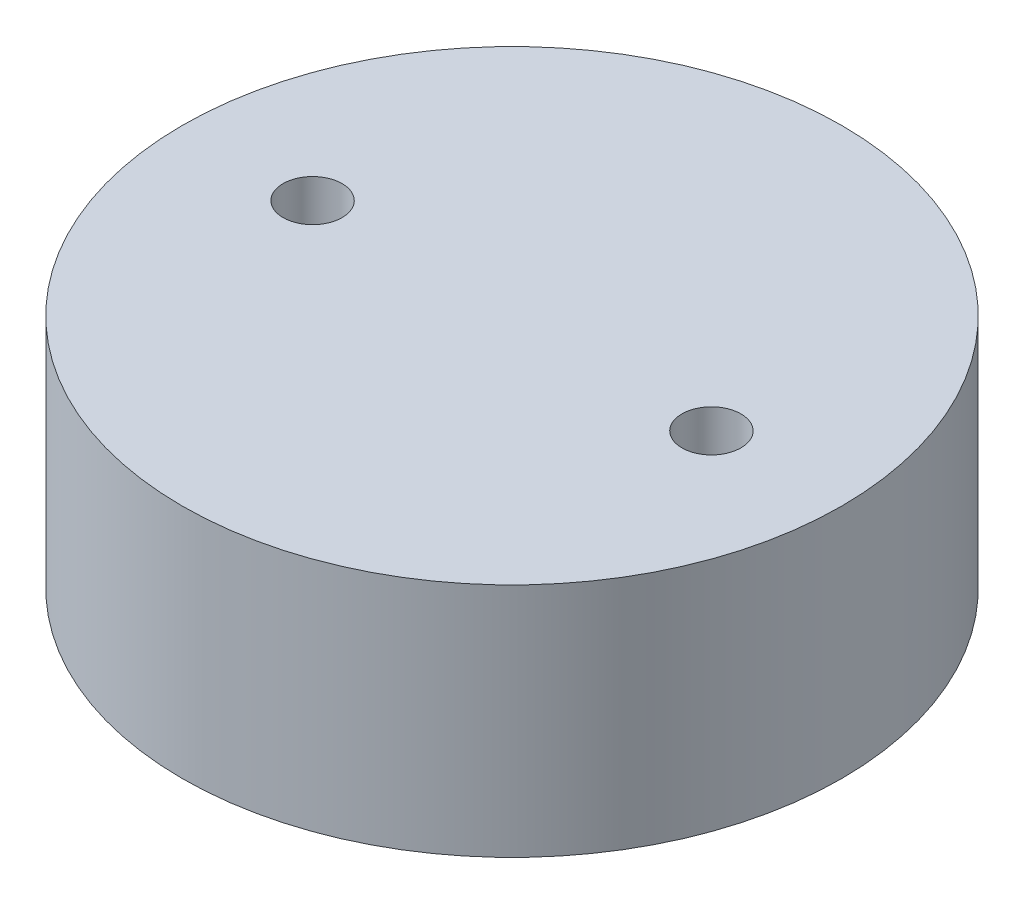
ISO-10303-21;
HEADER;
FILE_DESCRIPTION(('STEP AP214'),'2;1');
FILE_NAME('part.step','',(''),(''),'','','');
FILE_SCHEMA(('AUTOMOTIVE_DESIGN { 1 0 10303 214 1 1 1 1 }'));
ENDSEC;
DATA;
#1=APPLICATION_CONTEXT('core data for automotive mechanical design processes');
#2=APPLICATION_PROTOCOL_DEFINITION('international standard','automotive_design',2000,#1);
#3=PRODUCT_CONTEXT('',#1,'mechanical');
#4=PRODUCT('Part','Part','',(#3));
#5=PRODUCT_RELATED_PRODUCT_CATEGORY('part','',(#4));
#6=PRODUCT_DEFINITION_FORMATION('','',#4);
#7=PRODUCT_DEFINITION_CONTEXT('part definition',#1,'design');
#8=PRODUCT_DEFINITION('design','',#6,#7);
#9=PRODUCT_DEFINITION_SHAPE('','',#8);
#10=(LENGTH_UNIT() NAMED_UNIT(*) SI_UNIT(.MILLI.,.METRE.));
#11=(NAMED_UNIT(*) PLANE_ANGLE_UNIT() SI_UNIT($,.RADIAN.));
#12=(NAMED_UNIT(*) SI_UNIT($,.STERADIAN.) SOLID_ANGLE_UNIT());
#13=UNCERTAINTY_MEASURE_WITH_UNIT(LENGTH_MEASURE(1.E-05),#10,'distance_accuracy_value','');
#14=(GEOMETRIC_REPRESENTATION_CONTEXT(3) GLOBAL_UNCERTAINTY_ASSIGNED_CONTEXT((#13)) GLOBAL_UNIT_ASSIGNED_CONTEXT((#10,
#11,#12)) REPRESENTATION_CONTEXT('',''));
#15=CARTESIAN_POINT('',(0.,0.,0.));
#16=DIRECTION('',(0.,0.,1.));
#17=DIRECTION('',(1.,0.,0.));
#18=AXIS2_PLACEMENT_3D('',#15,#16,#17);
#19=CARTESIAN_POINT('',(0.,10.,0.));
#20=DIRECTION('',(0.,1.,0.));
#21=DIRECTION('',(0.,0.,1.));
#22=AXIS2_PLACEMENT_3D('',#19,#20,#21);
#23=PLANE('',#22);
#24=CARTESIAN_POINT('',(-8.45,10.,0.));
#25=DIRECTION('',(0.,1.,0.));
#26=DIRECTION('',(0.,0.,1.));
#27=AXIS2_PLACEMENT_3D('',#24,#25,#26);
#28=CIRCLE('',#27,1.25);
#29=CARTESIAN_POINT('',(-8.45,10.,1.25));
#30=VERTEX_POINT('',#29);
#31=EDGE_CURVE('E41',#30,#30,#28,.T.);
#32=ORIENTED_EDGE('',*,*,#31,.F.);
#33=EDGE_LOOP('',(#32));
#34=FACE_BOUND('',#33,.T.);
#35=CARTESIAN_POINT('',(0.,10.,0.));
#36=DIRECTION('',(0.,1.,0.));
#37=DIRECTION('',(0.,0.,1.));
#38=AXIS2_PLACEMENT_3D('',#35,#36,#37);
#39=CIRCLE('',#38,13.97);
#40=CARTESIAN_POINT('',(0.,10.,13.97));
#41=VERTEX_POINT('',#40);
#42=EDGE_CURVE('E10',#41,#41,#39,.T.);
#43=ORIENTED_EDGE('',*,*,#42,.T.);
#44=EDGE_LOOP('',(#43));
#45=FACE_BOUND('',#44,.T.);
#46=CARTESIAN_POINT('',(8.45,10.,0.));
#47=DIRECTION('',(0.,1.,0.));
#48=DIRECTION('',(0.,0.,-1.));
#49=AXIS2_PLACEMENT_3D('',#46,#47,#48);
#50=CIRCLE('',#49,1.25);
#51=CARTESIAN_POINT('',(8.45,10.,-1.25));
#52=VERTEX_POINT('',#51);
#53=EDGE_CURVE('E46',#52,#52,#50,.T.);
#54=ORIENTED_EDGE('',*,*,#53,.F.);
#55=EDGE_LOOP('',(#54));
#56=FACE_BOUND('',#55,.T.);
#57=ADVANCED_FACE('F30',(#34,#45,#56),#23,.T.);
#58=CARTESIAN_POINT('',(0.,0.,0.));
#59=DIRECTION('',(0.,1.,0.));
#60=DIRECTION('',(0.,0.,1.));
#61=AXIS2_PLACEMENT_3D('',#58,#59,#60);
#62=PLANE('',#61);
#63=CARTESIAN_POINT('',(-8.45,0.,0.));
#64=DIRECTION('',(0.,1.,0.));
#65=DIRECTION('',(0.,0.,1.));
#66=AXIS2_PLACEMENT_3D('',#63,#64,#65);
#67=CIRCLE('',#66,1.25);
#68=CARTESIAN_POINT('',(-8.45,0.,1.25));
#69=VERTEX_POINT('',#68);
#70=EDGE_CURVE('E43',#69,#69,#67,.T.);
#71=ORIENTED_EDGE('',*,*,#70,.T.);
#72=EDGE_LOOP('',(#71));
#73=FACE_BOUND('',#72,.T.);
#74=CARTESIAN_POINT('',(0.,0.,0.));
#75=DIRECTION('',(0.,1.,0.));
#76=DIRECTION('',(0.,0.,1.));
#77=AXIS2_PLACEMENT_3D('',#74,#75,#76);
#78=CIRCLE('',#77,13.97);
#79=CARTESIAN_POINT('',(0.,0.,13.97));
#80=VERTEX_POINT('',#79);
#81=EDGE_CURVE('E34',#80,#80,#78,.T.);
#82=ORIENTED_EDGE('',*,*,#81,.F.);
#83=EDGE_LOOP('',(#82));
#84=FACE_BOUND('',#83,.T.);
#85=CARTESIAN_POINT('',(8.45,0.,0.));
#86=DIRECTION('',(0.,1.,0.));
#87=DIRECTION('',(0.,0.,-1.));
#88=AXIS2_PLACEMENT_3D('',#85,#86,#87);
#89=CIRCLE('',#88,1.25);
#90=CARTESIAN_POINT('',(8.45,0.,-1.25));
#91=VERTEX_POINT('',#90);
#92=EDGE_CURVE('E49',#91,#91,#89,.T.);
#93=ORIENTED_EDGE('',*,*,#92,.T.);
#94=EDGE_LOOP('',(#93));
#95=FACE_BOUND('',#94,.T.);
#96=ADVANCED_FACE('F59',(#73,#84,#95),#62,.F.);
#97=CARTESIAN_POINT('',(0.,10.,0.));
#98=DIRECTION('',(0.,-1.,0.));
#99=DIRECTION('',(0.,0.,-1.));
#100=AXIS2_PLACEMENT_3D('',#97,#98,#99);
#101=CYLINDRICAL_SURFACE('',#100,13.97);
#102=ORIENTED_EDGE('',*,*,#42,.F.);
#103=EDGE_LOOP('',(#102));
#104=FACE_BOUND('',#103,.T.);
#105=ORIENTED_EDGE('',*,*,#81,.T.);
#106=EDGE_LOOP('',(#105));
#107=FACE_BOUND('',#106,.T.);
#108=ADVANCED_FACE('F32',(#104,#107),#101,.T.);
#109=CARTESIAN_POINT('',(-8.45,10.,0.));
#110=DIRECTION('',(0.,-1.,0.));
#111=DIRECTION('',(0.,0.,-1.));
#112=AXIS2_PLACEMENT_3D('',#109,#110,#111);
#113=CYLINDRICAL_SURFACE('',#112,1.25);
#114=ORIENTED_EDGE('',*,*,#31,.T.);
#115=EDGE_LOOP('',(#114));
#116=FACE_BOUND('',#115,.T.);
#117=ORIENTED_EDGE('',*,*,#70,.F.);
#118=EDGE_LOOP('',(#117));
#119=FACE_BOUND('',#118,.T.);
#120=ADVANCED_FACE('F68',(#116,#119),#113,.F.);
#121=CARTESIAN_POINT('',(8.45,10.,0.));
#122=DIRECTION('',(0.,-1.,0.));
#123=DIRECTION('',(0.,0.,-1.));
#124=AXIS2_PLACEMENT_3D('',#121,#122,#123);
#125=CYLINDRICAL_SURFACE('',#124,1.25);
#126=ORIENTED_EDGE('',*,*,#53,.T.);
#127=EDGE_LOOP('',(#126));
#128=FACE_BOUND('',#127,.T.);
#129=ORIENTED_EDGE('',*,*,#92,.F.);
#130=EDGE_LOOP('',(#129));
#131=FACE_BOUND('',#130,.T.);
#132=ADVANCED_FACE('F55',(#128,#131),#125,.F.);
#133=CLOSED_SHELL('',(#57,#96,#108,#120,#132));
#134=MANIFOLD_SOLID_BREP('B2',#133);
#135=ADVANCED_BREP_SHAPE_REPRESENTATION('',(#18,#134),#14);
#136=SHAPE_DEFINITION_REPRESENTATION(#9,#135);
ENDSEC;
END-ISO-10303-21;
